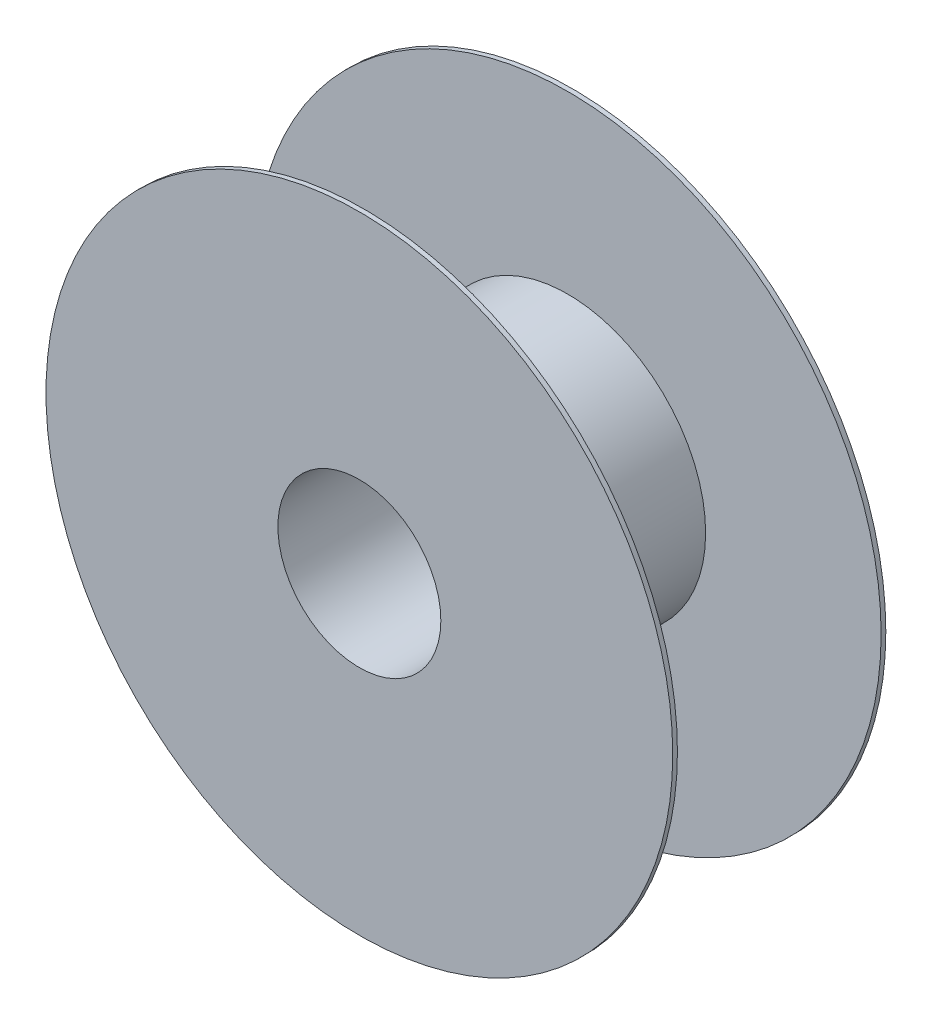
ISO-10303-21;
HEADER;
FILE_DESCRIPTION(('STEP AP214'),'2;1');
FILE_NAME('part.step','',(''),(''),'','','');
FILE_SCHEMA(('AUTOMOTIVE_DESIGN { 1 0 10303 214 1 1 1 1 }'));
ENDSEC;
DATA;
#1=APPLICATION_CONTEXT('core data for automotive mechanical design processes');
#2=APPLICATION_PROTOCOL_DEFINITION('international standard','automotive_design',2000,#1);
#3=PRODUCT_CONTEXT('',#1,'mechanical');
#4=PRODUCT('Part','Part','',(#3));
#5=PRODUCT_RELATED_PRODUCT_CATEGORY('part','',(#4));
#6=PRODUCT_DEFINITION_FORMATION('','',#4);
#7=PRODUCT_DEFINITION_CONTEXT('part definition',#1,'design');
#8=PRODUCT_DEFINITION('design','',#6,#7);
#9=PRODUCT_DEFINITION_SHAPE('','',#8);
#10=(LENGTH_UNIT() NAMED_UNIT(*) SI_UNIT(.MILLI.,.METRE.));
#11=(NAMED_UNIT(*) PLANE_ANGLE_UNIT() SI_UNIT($,.RADIAN.));
#12=(NAMED_UNIT(*) SI_UNIT($,.STERADIAN.) SOLID_ANGLE_UNIT());
#13=UNCERTAINTY_MEASURE_WITH_UNIT(LENGTH_MEASURE(1.E-05),#10,'distance_accuracy_value','');
#14=(GEOMETRIC_REPRESENTATION_CONTEXT(3) GLOBAL_UNCERTAINTY_ASSIGNED_CONTEXT((#13)) GLOBAL_UNIT_ASSIGNED_CONTEXT((#10,
#11,#12)) REPRESENTATION_CONTEXT('',''));
#15=CARTESIAN_POINT('',(0.,0.,0.));
#16=DIRECTION('',(0.,0.,1.));
#17=DIRECTION('',(1.,0.,0.));
#18=AXIS2_PLACEMENT_3D('',#15,#16,#17);
#19=CARTESIAN_POINT('',(0.,0.,-1.5));
#20=DIRECTION('',(0.,0.,1.));
#21=DIRECTION('',(1.,0.,0.));
#22=AXIS2_PLACEMENT_3D('',#19,#20,#21);
#23=CYLINDRICAL_SURFACE('',#22,100.);
#24=CARTESIAN_POINT('',(0.,0.,-1.5));
#25=DIRECTION('',(0.,0.,1.));
#26=DIRECTION('',(1.,0.,0.));
#27=AXIS2_PLACEMENT_3D('',#24,#25,#26);
#28=CIRCLE('',#27,100.);
#29=CARTESIAN_POINT('',(100.,0.,-1.5));
#30=VERTEX_POINT('',#29);
#31=EDGE_CURVE('E10',#30,#30,#28,.T.);
#32=ORIENTED_EDGE('',*,*,#31,.T.);
#33=EDGE_LOOP('',(#32));
#34=FACE_BOUND('',#33,.T.);
#35=CARTESIAN_POINT('',(0.,0.,0.));
#36=DIRECTION('',(0.,0.,1.));
#37=DIRECTION('',(1.,0.,0.));
#38=AXIS2_PLACEMENT_3D('',#35,#36,#37);
#39=CIRCLE('',#38,100.);
#40=CARTESIAN_POINT('',(100.,0.,0.));
#41=VERTEX_POINT('',#40);
#42=EDGE_CURVE('E44',#41,#41,#39,.T.);
#43=ORIENTED_EDGE('',*,*,#42,.F.);
#44=EDGE_LOOP('',(#43));
#45=FACE_BOUND('',#44,.T.);
#46=ADVANCED_FACE('F33',(#34,#45),#23,.T.);
#47=CARTESIAN_POINT('',(0.,0.,-1.5));
#48=DIRECTION('',(0.,0.,1.));
#49=DIRECTION('',(1.,0.,0.));
#50=AXIS2_PLACEMENT_3D('',#47,#48,#49);
#51=CYLINDRICAL_SURFACE('',#50,26.);
#52=CARTESIAN_POINT('',(0.,0.,0.));
#53=DIRECTION('',(0.,0.,1.));
#54=DIRECTION('',(1.,0.,0.));
#55=AXIS2_PLACEMENT_3D('',#52,#53,#54);
#56=CIRCLE('',#55,26.);
#57=CARTESIAN_POINT('',(26.,0.,0.));
#58=VERTEX_POINT('',#57);
#59=EDGE_CURVE('E36',#58,#58,#56,.T.);
#60=ORIENTED_EDGE('',*,*,#59,.T.);
#61=EDGE_LOOP('',(#60));
#62=FACE_BOUND('',#61,.T.);
#63=CARTESIAN_POINT('',(0.,0.,-68.));
#64=DIRECTION('',(0.,0.,1.));
#65=DIRECTION('',(1.,0.,0.));
#66=AXIS2_PLACEMENT_3D('',#63,#64,#65);
#67=CIRCLE('',#66,26.);
#68=CARTESIAN_POINT('',(26.,0.,-68.));
#69=VERTEX_POINT('',#68);
#70=EDGE_CURVE('E56',#69,#69,#67,.T.);
#71=ORIENTED_EDGE('',*,*,#70,.F.);
#72=EDGE_LOOP('',(#71));
#73=FACE_BOUND('',#72,.T.);
#74=ADVANCED_FACE('F87',(#62,#73),#51,.F.);
#75=CARTESIAN_POINT('',(0.,0.,-1.5));
#76=DIRECTION('',(0.,0.,1.));
#77=DIRECTION('',(1.,0.,0.));
#78=AXIS2_PLACEMENT_3D('',#75,#76,#77);
#79=PLANE('',#78);
#80=CARTESIAN_POINT('',(0.,0.,-1.5));
#81=DIRECTION('',(0.,0.,1.));
#82=DIRECTION('',(1.,0.,0.));
#83=AXIS2_PLACEMENT_3D('',#80,#81,#82);
#84=CIRCLE('',#83,44.);
#85=CARTESIAN_POINT('',(44.,0.,-1.5));
#86=VERTEX_POINT('',#85);
#87=EDGE_CURVE('E46',#86,#86,#84,.T.);
#88=ORIENTED_EDGE('',*,*,#87,.T.);
#89=EDGE_LOOP('',(#88));
#90=FACE_BOUND('',#89,.T.);
#91=ORIENTED_EDGE('',*,*,#31,.F.);
#92=EDGE_LOOP('',(#91));
#93=FACE_BOUND('',#92,.T.);
#94=ADVANCED_FACE('F91',(#90,#93),#79,.F.);
#95=CARTESIAN_POINT('',(0.,0.,0.));
#96=DIRECTION('',(0.,0.,1.));
#97=DIRECTION('',(1.,0.,0.));
#98=AXIS2_PLACEMENT_3D('',#95,#96,#97);
#99=PLANE('',#98);
#100=ORIENTED_EDGE('',*,*,#42,.T.);
#101=EDGE_LOOP('',(#100));
#102=FACE_BOUND('',#101,.T.);
#103=ORIENTED_EDGE('',*,*,#59,.F.);
#104=EDGE_LOOP('',(#103));
#105=FACE_BOUND('',#104,.T.);
#106=ADVANCED_FACE('F97',(#102,#105),#99,.T.);
#107=CARTESIAN_POINT('',(0.,0.,-34.));
#108=DIRECTION('',(0.,0.,1.));
#109=DIRECTION('',(1.,0.,0.));
#110=AXIS2_PLACEMENT_3D('',#107,#108,#109);
#111=CYLINDRICAL_SURFACE('',#110,44.);
#112=ORIENTED_EDGE('',*,*,#87,.F.);
#113=EDGE_LOOP('',(#112));
#114=FACE_BOUND('',#113,.T.);
#115=CARTESIAN_POINT('',(0.,0.,-66.5));
#116=DIRECTION('',(0.,0.,1.));
#117=DIRECTION('',(1.,0.,0.));
#118=AXIS2_PLACEMENT_3D('',#115,#116,#117);
#119=CIRCLE('',#118,44.);
#120=CARTESIAN_POINT('',(44.,0.,-66.5));
#121=VERTEX_POINT('',#120);
#122=EDGE_CURVE('E64',#121,#121,#119,.T.);
#123=ORIENTED_EDGE('',*,*,#122,.T.);
#124=EDGE_LOOP('',(#123));
#125=FACE_BOUND('',#124,.T.);
#126=ADVANCED_FACE('F71',(#114,#125),#111,.T.);
#127=CARTESIAN_POINT('',(0.,0.,-66.5));
#128=DIRECTION('',(0.,0.,-1.));
#129=DIRECTION('',(1.,0.,0.));
#130=AXIS2_PLACEMENT_3D('',#127,#128,#129);
#131=CYLINDRICAL_SURFACE('',#130,100.);
#132=CARTESIAN_POINT('',(0.,0.,-66.5));
#133=DIRECTION('',(0.,0.,1.));
#134=DIRECTION('',(1.,0.,0.));
#135=AXIS2_PLACEMENT_3D('',#132,#133,#134);
#136=CIRCLE('',#135,100.);
#137=CARTESIAN_POINT('',(100.,0.,-66.5));
#138=VERTEX_POINT('',#137);
#139=EDGE_CURVE('E52',#138,#138,#136,.T.);
#140=ORIENTED_EDGE('',*,*,#139,.F.);
#141=EDGE_LOOP('',(#140));
#142=FACE_BOUND('',#141,.T.);
#143=CARTESIAN_POINT('',(0.,0.,-68.));
#144=DIRECTION('',(0.,0.,1.));
#145=DIRECTION('',(1.,0.,0.));
#146=AXIS2_PLACEMENT_3D('',#143,#144,#145);
#147=CIRCLE('',#146,100.);
#148=CARTESIAN_POINT('',(100.,0.,-68.));
#149=VERTEX_POINT('',#148);
#150=EDGE_CURVE('E61',#149,#149,#147,.T.);
#151=ORIENTED_EDGE('',*,*,#150,.T.);
#152=EDGE_LOOP('',(#151));
#153=FACE_BOUND('',#152,.T.);
#154=ADVANCED_FACE('F76',(#142,#153),#131,.T.);
#155=CARTESIAN_POINT('',(0.,0.,-66.5));
#156=DIRECTION('',(0.,0.,-1.));
#157=DIRECTION('',(1.,0.,0.));
#158=AXIS2_PLACEMENT_3D('',#155,#156,#157);
#159=PLANE('',#158);
#160=ORIENTED_EDGE('',*,*,#122,.F.);
#161=EDGE_LOOP('',(#160));
#162=FACE_BOUND('',#161,.T.);
#163=ORIENTED_EDGE('',*,*,#139,.T.);
#164=EDGE_LOOP('',(#163));
#165=FACE_BOUND('',#164,.T.);
#166=ADVANCED_FACE('F73',(#162,#165),#159,.F.);
#167=CARTESIAN_POINT('',(0.,0.,-68.));
#168=DIRECTION('',(0.,0.,-1.));
#169=DIRECTION('',(1.,0.,0.));
#170=AXIS2_PLACEMENT_3D('',#167,#168,#169);
#171=PLANE('',#170);
#172=ORIENTED_EDGE('',*,*,#150,.F.);
#173=EDGE_LOOP('',(#172));
#174=FACE_BOUND('',#173,.T.);
#175=ORIENTED_EDGE('',*,*,#70,.T.);
#176=EDGE_LOOP('',(#175));
#177=FACE_BOUND('',#176,.T.);
#178=ADVANCED_FACE('F75',(#174,#177),#171,.T.);
#179=CLOSED_SHELL('',(#46,#74,#94,#106,#126,#154,#166,#178));
#180=MANIFOLD_SOLID_BREP('B2',#179);
#181=ADVANCED_BREP_SHAPE_REPRESENTATION('',(#18,#180),#14);
#182=SHAPE_DEFINITION_REPRESENTATION(#9,#181);
ENDSEC;
END-ISO-10303-21;
